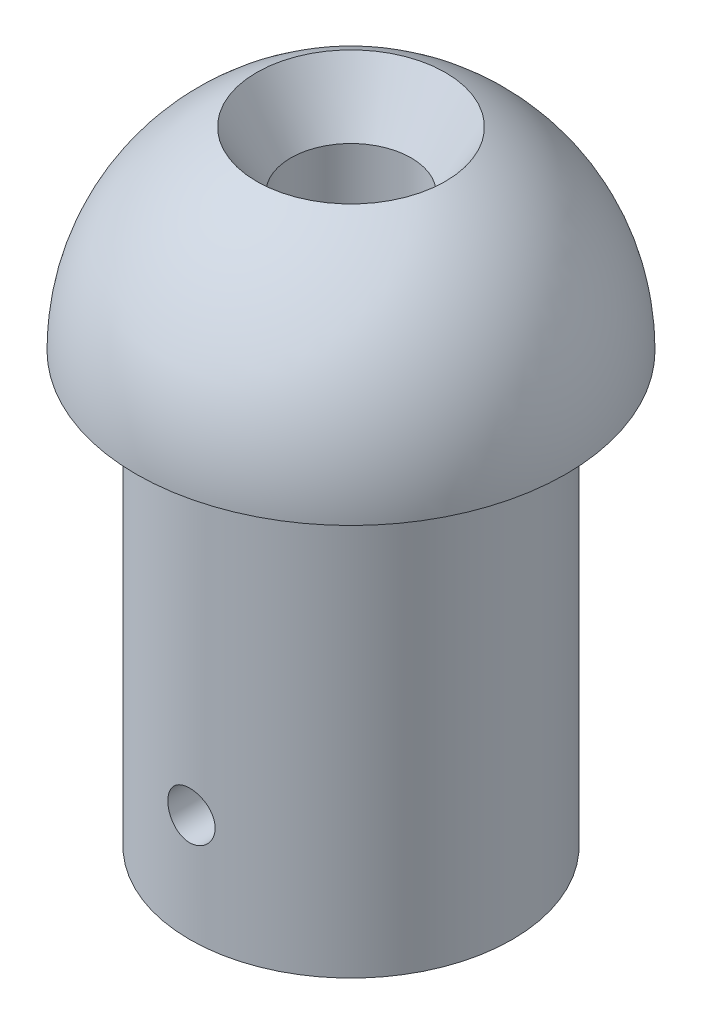
ISO-10303-21;
HEADER;
FILE_DESCRIPTION(('STEP AP214'),'2;1');
FILE_NAME('part.step','',(''),(''),'','','');
FILE_SCHEMA(('AUTOMOTIVE_DESIGN { 1 0 10303 214 1 1 1 1 }'));
ENDSEC;
DATA;
#1=APPLICATION_CONTEXT('core data for automotive mechanical design processes');
#2=APPLICATION_PROTOCOL_DEFINITION('international standard','automotive_design',2000,#1);
#3=PRODUCT_CONTEXT('',#1,'mechanical');
#4=PRODUCT('Part','Part','',(#3));
#5=PRODUCT_RELATED_PRODUCT_CATEGORY('part','',(#4));
#6=PRODUCT_DEFINITION_FORMATION('','',#4);
#7=PRODUCT_DEFINITION_CONTEXT('part definition',#1,'design');
#8=PRODUCT_DEFINITION('design','',#6,#7);
#9=PRODUCT_DEFINITION_SHAPE('','',#8);
#10=(LENGTH_UNIT() NAMED_UNIT(*) SI_UNIT(.MILLI.,.METRE.));
#11=(NAMED_UNIT(*) PLANE_ANGLE_UNIT() SI_UNIT($,.RADIAN.));
#12=(NAMED_UNIT(*) SI_UNIT($,.STERADIAN.) SOLID_ANGLE_UNIT());
#13=UNCERTAINTY_MEASURE_WITH_UNIT(LENGTH_MEASURE(1.E-05),#10,'distance_accuracy_value','');
#14=(GEOMETRIC_REPRESENTATION_CONTEXT(3) GLOBAL_UNCERTAINTY_ASSIGNED_CONTEXT((#13)) GLOBAL_UNIT_ASSIGNED_CONTEXT((#10,
#11,#12)) REPRESENTATION_CONTEXT('',''));
#15=CARTESIAN_POINT('',(0.,0.,0.));
#16=DIRECTION('',(0.,0.,1.));
#17=DIRECTION('',(1.,0.,0.));
#18=AXIS2_PLACEMENT_3D('',#15,#16,#17);
#19=CARTESIAN_POINT('',(12.7,0.,0.));
#20=DIRECTION('',(0.,1.,0.));
#21=DIRECTION('',(0.,0.,1.));
#22=AXIS2_PLACEMENT_3D('',#19,#20,#21);
#23=PLANE('',#22);
#24=CARTESIAN_POINT('',(0.,0.,0.));
#25=DIRECTION('',(0.,1.,0.));
#26=DIRECTION('',(0.,0.,1.));
#27=AXIS2_PLACEMENT_3D('',#24,#25,#26);
#28=CIRCLE('',#27,12.7);
#29=CARTESIAN_POINT('',(0.,0.,12.7));
#30=VERTEX_POINT('',#29);
#31=EDGE_CURVE('E41',#30,#30,#28,.T.);
#32=ORIENTED_EDGE('',*,*,#31,.F.);
#33=EDGE_LOOP('',(#32));
#34=FACE_BOUND('',#33,.T.);
#35=CARTESIAN_POINT('',(0.,0.,0.));
#36=DIRECTION('',(0.,1.,0.));
#37=DIRECTION('',(0.,0.,1.));
#38=AXIS2_PLACEMENT_3D('',#35,#36,#37);
#39=CIRCLE('',#38,9.525);
#40=CARTESIAN_POINT('',(0.,0.,9.525));
#41=VERTEX_POINT('',#40);
#42=EDGE_CURVE('E10',#41,#41,#39,.F.);
#43=ORIENTED_EDGE('',*,*,#42,.F.);
#44=EDGE_LOOP('',(#43));
#45=FACE_BOUND('',#44,.T.);
#46=ADVANCED_FACE('F30',(#34,#45),#23,.F.);
#47=CARTESIAN_POINT('',(0.,0.,0.));
#48=DIRECTION('',(0.,1.,0.));
#49=DIRECTION('',(1.,0.,0.));
#50=AXIS2_PLACEMENT_3D('',#47,#48,#49);
#51=SPHERICAL_SURFACE('',#50,12.7);
#52=CARTESIAN_POINT('',(0.,11.4107623075787,0.));
#53=DIRECTION('',(0.,-1.,0.));
#54=DIRECTION('',(0.,0.,-1.));
#55=AXIS2_PLACEMENT_3D('',#52,#53,#54);
#56=CIRCLE('',#55,5.57534784205806);
#57=CARTESIAN_POINT('',(0.,11.4107623075787,-5.57534784205806));
#58=VERTEX_POINT('',#57);
#59=EDGE_CURVE('E52',#58,#58,#56,.T.);
#60=ORIENTED_EDGE('',*,*,#59,.T.);
#61=EDGE_LOOP('',(#60));
#62=FACE_BOUND('',#61,.T.);
#63=ORIENTED_EDGE('',*,*,#31,.T.);
#64=EDGE_LOOP('',(#63));
#65=FACE_BOUND('',#64,.T.);
#66=ADVANCED_FACE('F85',(#62,#65),#51,.T.);
#67=CARTESIAN_POINT('',(0.,-25.4,0.));
#68=DIRECTION('',(0.,1.,0.));
#69=DIRECTION('',(0.,0.,1.));
#70=AXIS2_PLACEMENT_3D('',#67,#68,#69);
#71=CYLINDRICAL_SURFACE('',#70,9.525);
#72=CARTESIAN_POINT('',(0.,-20.447,9.525));
#73=CARTESIAN_POINT('',(-0.0780210704996163,-20.4469967672233,9.52499876909918));
#74=CARTESIAN_POINT('',(-0.156087914584497,-20.4404418385136,9.52403131437803));
#75=CARTESIAN_POINT('',(-0.310040917925296,-20.4144011568612,9.52026504812402));
#76=CARTESIAN_POINT('',(-0.385924855077812,-20.3949026823453,9.51746443490786));
#77=CARTESIAN_POINT('',(-0.533261643560541,-20.3435688802958,9.51034668937885));
#78=CARTESIAN_POINT('',(-0.604717745984399,-20.3117427317798,9.50603068562822));
#79=CARTESIAN_POINT('',(-0.741263844751881,-20.2366791185375,9.49635952075439));
#80=CARTESIAN_POINT('',(-0.806354753006522,-20.1934432917139,9.49100450881394));
#81=CARTESIAN_POINT('',(-0.928821082462877,-20.0964427980264,9.47980636130476));
#82=CARTESIAN_POINT('',(-0.986141981470261,-20.0426096371309,9.47396020022846));
#83=CARTESIAN_POINT('',(-1.09097086941622,-19.9260899654613,9.46246243475263));
#84=CARTESIAN_POINT('',(-1.13847830367028,-19.8634029545798,9.45681084136564));
#85=CARTESIAN_POINT('',(-1.22254270332514,-19.7305903299866,9.44631270759135));
#86=CARTESIAN_POINT('',(-1.25904714472436,-19.6604311351754,9.44147007635094));
#87=CARTESIAN_POINT('',(-1.31973370841209,-19.5148945418098,9.43317930633493));
#88=CARTESIAN_POINT('',(-1.34391647255257,-19.4395174152965,9.42973109492414));
#89=CARTESIAN_POINT('',(-1.37910438639669,-19.2862570823896,9.42464922825738));
#90=CARTESIAN_POINT('',(-1.39020271382686,-19.2083957021566,9.42300274850874));
#91=CARTESIAN_POINT('',(-1.39919532244802,-19.0518996355701,9.42167179392556));
#92=CARTESIAN_POINT('',(-1.39709032893349,-18.9732649919311,9.42198721131866));
#93=CARTESIAN_POINT('',(-1.37981224341869,-18.8181114864146,9.4245326835761));
#94=CARTESIAN_POINT('',(-1.36474276362178,-18.7415808012875,9.42674755753626));
#95=CARTESIAN_POINT('',(-1.32212559058948,-18.5921461095556,9.43281867440035));
#96=CARTESIAN_POINT('',(-1.29457755858661,-18.5192422014701,9.43667496186517));
#97=CARTESIAN_POINT('',(-1.22767699082081,-18.378814340724,9.44561123341711));
#98=CARTESIAN_POINT('',(-1.18828040503306,-18.3113116752701,9.45069576970471));
#99=CARTESIAN_POINT('',(-1.09883244492729,-18.183836053757,9.46151231965172));
#100=CARTESIAN_POINT('',(-1.04878040161725,-18.1238635708487,9.46724437395429));
#101=CARTESIAN_POINT('',(-0.938872789734266,-18.0125500838765,9.47877723825155));
#102=CARTESIAN_POINT('',(-0.87892810568412,-17.9612970427175,9.48457818182425));
#103=CARTESIAN_POINT('',(-0.751240994055762,-17.869565520666,9.49554428112557));
#104=CARTESIAN_POINT('',(-0.683498534990984,-17.8290870832824,9.50070943428676));
#105=CARTESIAN_POINT('',(-0.542063795670929,-17.7600499226544,9.50982703811476));
#106=CARTESIAN_POINT('',(-0.468368246360631,-17.7314978024135,9.51377881667706));
#107=CARTESIAN_POINT('',(-0.317157481006443,-17.6871992807633,9.52001873749491));
#108=CARTESIAN_POINT('',(-0.239642512080121,-17.6714520520248,9.52230698723073));
#109=CARTESIAN_POINT('',(-0.083752652687727,-17.6533268608748,9.52494783057845));
#110=CARTESIAN_POINT('',(-0.00539211241790786,-17.6508279330495,9.52531793735466));
#111=CARTESIAN_POINT('',(0.150629263927545,-17.6589494647484,9.52412841076372));
#112=CARTESIAN_POINT('',(0.228290120616937,-17.6695695364852,9.5225688344365));
#113=CARTESIAN_POINT('',(0.380342575781186,-17.7035270248034,9.51770601460028));
#114=CARTESIAN_POINT('',(0.454747575371576,-17.7268056876243,9.51441082897403));
#115=CARTESIAN_POINT('',(0.598598436432949,-17.7853577295366,9.50644515021481));
#116=CARTESIAN_POINT('',(0.668044073759443,-17.8206316503538,9.50177459496912));
#117=CARTESIAN_POINT('',(0.800538017888206,-17.90245797401,9.49153388290808));
#118=CARTESIAN_POINT('',(0.863538324836485,-17.9490873280162,9.48595767860855));
#119=CARTESIAN_POINT('',(0.980862347167357,-18.0521935003978,9.47454564183429));
#120=CARTESIAN_POINT('',(1.03518558127107,-18.1086708646357,9.46870979498127));
#121=CARTESIAN_POINT('',(1.13405200766557,-18.2304075991034,9.45738088813976));
#122=CARTESIAN_POINT('',(1.17851423763999,-18.2957330520076,9.45189091304804));
#123=CARTESIAN_POINT('',(1.25583427244825,-18.4329962484372,9.44192943482414));
#124=CARTESIAN_POINT('',(1.288692379862,-18.5049338194888,9.43745790513685));
#125=CARTESIAN_POINT('',(1.34174515764188,-18.653134953303,9.43006176055464));
#126=CARTESIAN_POINT('',(1.36198286842134,-18.7293828349094,9.42713189339786));
#127=CARTESIAN_POINT('',(1.3893576162155,-18.8842412428705,9.42313668695638));
#128=CARTESIAN_POINT('',(1.39649551479598,-18.9628516135003,9.42207122505122));
#129=CARTESIAN_POINT('',(1.39744819289425,-19.1193968047977,9.42192990451066));
#130=CARTESIAN_POINT('',(1.39139025343123,-19.197330863679,9.42283503836564));
#131=CARTESIAN_POINT('',(1.36639551201491,-19.351059225311,9.42649167860844));
#132=CARTESIAN_POINT('',(1.34745872714735,-19.4268535309002,9.42924318254678));
#133=CARTESIAN_POINT('',(1.29728812222023,-19.5741182249609,9.43627600219572));
#134=CARTESIAN_POINT('',(1.26606280699116,-19.645591564568,9.44055625967463));
#135=CARTESIAN_POINT('',(1.19221413195192,-19.7823054538423,9.45016565611076));
#136=CARTESIAN_POINT('',(1.1495904205166,-19.8475458111461,9.45549482742422));
#137=CARTESIAN_POINT('',(1.05369098517627,-19.9705890957686,9.46666284878057));
#138=CARTESIAN_POINT('',(1.00032089047267,-20.0283180943339,9.47250593597053));
#139=CARTESIAN_POINT('',(0.884643000756661,-20.1340463566769,9.48400774997678));
#140=CARTESIAN_POINT('',(0.822333127600794,-20.1820433518721,9.48966643355017));
#141=CARTESIAN_POINT('',(0.6901605685792,-20.2671690708114,9.50019567498149));
#142=CARTESIAN_POINT('',(0.62025994446501,-20.3042394076122,9.50506193879451));
#143=CARTESIAN_POINT('',(0.475187102460737,-20.3660585882825,9.51341580822303));
#144=CARTESIAN_POINT('',(0.400020477054556,-20.3908202842076,9.51690485107505));
#145=CARTESIAN_POINT('',(0.270424094763482,-20.4216569679818,9.52130826650232));
#146=CARTESIAN_POINT('',(0.216796975750918,-20.4311462072659,9.52268560961624));
#147=CARTESIAN_POINT('',(0.108787317613575,-20.4438188137598,9.52453190024634));
#148=CARTESIAN_POINT('',(0.0544047872741919,-20.447002254244,9.5250008583181));
#149=CARTESIAN_POINT('',(0.,-20.447,9.525));
#150=B_SPLINE_CURVE_WITH_KNOTS('',3,(#72,#73,#74,#75,#76,#77,#78,#79,#80,#81,#82,#83,#84,#85,
#86,#87,#88,#89,#90,#91,#92,#93,#94,#95,#96,#97,#98,#99,#100,#101,#102,#103,#104,#105,#106,#107,
#108,#109,#110,#111,#112,#113,#114,#115,#116,#117,#118,#119,#120,#121,#122,#123,#124,#125,#126,
#127,#128,#129,#130,#131,#132,#133,#134,#135,#136,#137,#138,#139,#140,#141,#142,#143,#144,#145,
#146,#147,#148,#149),.UNSPECIFIED.,.T.,.F.,(4,2,2,2,2,2,2,2,2,2,2,2,2,2,2,2,2,2,2,2,2,2,2,2,2,2,
2,2,2,2,2,2,2,2,2,2,2,2,4),(0.,0.233864421952269,0.467959038712357,0.701879685847083,
0.935766771037242,1.17121835301088,1.40668323972786,1.64325496344466,1.87981436257677,
2.11467878420653,2.34953030420524,2.58252214389512,2.81552030922159,3.04939564368206,
3.28328566609961,3.51941083672099,3.75553696082351,3.99179364338662,4.22803506009366,
4.46211568008177,4.69618938099253,4.92918580855113,5.16219276001445,5.39682493179859,
5.63147011307648,5.8679758205864,6.10447536070527,6.34016387098805,6.57583687964128,
6.80924676781341,7.04265634633265,7.27590466653922,7.50916018297206,7.74456117632801,
7.98001697999564,8.21670904259757,8.45315344153476,8.6162310806358,8.77930682473723),.UNSPECIFIED.);
#151=CARTESIAN_POINT('',(0.,-20.447,9.525));
#152=VERTEX_POINT('',#151);
#153=EDGE_CURVE('E53',#152,#152,#150,.T.);
#154=ORIENTED_EDGE('',*,*,#153,.T.);
#155=EDGE_LOOP('',(#154));
#156=FACE_BOUND('',#155,.T.);
#157=CARTESIAN_POINT('',(1.397,-19.05,-9.42199639142363));
#158=CARTESIAN_POINT('',(1.39699676285134,-18.9719840173659,-9.42199767288179));
#159=CARTESIAN_POINT('',(1.39044266017382,-18.8939222472952,-9.42297585532093));
#160=CARTESIAN_POINT('',(1.36440555734869,-18.7399797842974,-9.4267804122333));
#161=CARTESIAN_POINT('',(1.34490981732576,-18.6641013175062,-9.42960860783764));
#162=CARTESIAN_POINT('',(1.29358401255455,-18.5167761031052,-9.43678612767054));
#163=CARTESIAN_POINT('',(1.26176325618378,-18.4453260580905,-9.44113430370408));
#164=CARTESIAN_POINT('',(1.18671234609414,-18.308790133863,-9.45086048847592));
#165=CARTESIAN_POINT('',(1.14348381732021,-18.2437033500633,-9.45623835051386));
#166=CARTESIAN_POINT('',(1.04649073897578,-18.121232466278,-9.46746402139572));
#167=CARTESIAN_POINT('',(0.99265606112939,-18.0639041706813,-9.47331479643173));
#168=CARTESIAN_POINT('',(0.876130236233863,-17.9590609777023,-9.48480055763751));
#169=CARTESIAN_POINT('',(0.813438609403231,-17.9115466122848,-9.49043553209633));
#170=CARTESIAN_POINT('',(0.680621838342373,-17.8274748825157,-9.5008857333761));
#171=CARTESIAN_POINT('',(0.610463907209016,-17.7909687916549,-9.50569708038088));
#172=CARTESIAN_POINT('',(0.464930056832701,-17.7302788312865,-9.51392509841223));
#173=CARTESIAN_POINT('',(0.389554401660724,-17.7060943386952,-9.51734183996003));
#174=CARTESIAN_POINT('',(0.236298990795833,-17.6709029340882,-9.52237475131293));
#175=CARTESIAN_POINT('',(0.158441100752521,-17.659802652339,-9.52400367328308));
#176=CARTESIAN_POINT('',(0.00195189879086971,-17.6508049253288,-9.52532109390816));
#177=CARTESIAN_POINT('',(-0.0766793717106279,-17.6529067768565,-9.52500969591421));
#178=CARTESIAN_POINT('',(-0.231846511145324,-17.6701798050635,-9.52249176998468));
#179=CARTESIAN_POINT('',(-0.308393831490629,-17.685250535682,-9.52029980771572));
#180=CARTESIAN_POINT('',(-0.457861144543363,-17.7278759444575,-9.514283279723));
#181=CARTESIAN_POINT('',(-0.530781047201157,-17.7554309323612,-9.51045867349187));
#182=CARTESIAN_POINT('',(-0.671228616910437,-17.8223460701718,-9.50158153454396));
#183=CARTESIAN_POINT('',(-0.738735766970222,-17.8617486750733,-9.49652459843429));
#184=CARTESIAN_POINT('',(-0.866217821814206,-17.9512095723672,-9.48574670878224));
#185=CARTESIAN_POINT('',(-0.926192251895769,-18.0012685357748,-9.48002571343535));
#186=CARTESIAN_POINT('',(-1.03749823354175,-18.1111811617227,-9.46849454743781));
#187=CARTESIAN_POINT('',(-1.08874320977274,-18.171122501068,-9.46268404410849));
#188=CARTESIAN_POINT('',(-1.18046003834951,-18.2988000103715,-9.45168130669168));
#189=CARTESIAN_POINT('',(-1.22093182975891,-18.3665362244167,-9.44648907610142));
#190=CARTESIAN_POINT('',(-1.28996416457376,-18.5079690558613,-9.43731089411525));
#191=CARTESIAN_POINT('',(-1.31851609183275,-18.581669938976,-9.43332581586551));
#192=CARTESIAN_POINT('',(-1.36281260310173,-18.7328923296602,-9.42702880542894));
#193=CARTESIAN_POINT('',(-1.37855804813815,-18.8104135800009,-9.42471676075913));
#194=CARTESIAN_POINT('',(-1.39667649173775,-18.9663066994471,-9.4220488299596));
#195=CARTESIAN_POINT('',(-1.39917208881502,-19.0446640236169,-9.42167501053179));
#196=CARTESIAN_POINT('',(-1.39104504342604,-19.200678175921,-9.42287827070066));
#197=CARTESIAN_POINT('',(-1.3804227895134,-19.2783350247348,-9.42445529251299));
#198=CARTESIAN_POINT('',(-1.34646544255553,-19.4303658064378,-9.4293660870893));
#199=CARTESIAN_POINT('',(-1.32319118218221,-19.5047536221445,-9.43269145108022));
#200=CARTESIAN_POINT('',(-1.2646536775187,-19.6485720550273,-9.44071732924662));
#201=CARTESIAN_POINT('',(-1.22938986516604,-19.7180024371327,-9.44541790857805));
#202=CARTESIAN_POINT('',(-1.14757872497051,-19.8504854364628,-9.45570693407215));
#203=CARTESIAN_POINT('',(-1.10095188655486,-19.9134884678601,-9.46130153660652));
#204=CARTESIAN_POINT('',(-0.997849056792462,-20.0308191529752,-9.47272958734958));
#205=CARTESIAN_POINT('',(-0.941372533749071,-20.0851463380581,-9.47856304843911));
#206=CARTESIAN_POINT('',(-0.819634195300519,-20.1840220915202,-9.48986744592369));
#207=CARTESIAN_POINT('',(-0.754306123443428,-20.2284895094429,-9.49533513254887));
#208=CARTESIAN_POINT('',(-0.617036229955225,-20.305818636582,-9.50524170480229));
#209=CARTESIAN_POINT('',(-0.545094582788759,-20.3386806518357,-9.50968061755849));
#210=CARTESIAN_POINT('',(-0.396895385298016,-20.3917358515556,-9.51701523336544));
#211=CARTESIAN_POINT('',(-0.320654129318384,-20.4119737668575,-9.51991637961139));
#212=CARTESIAN_POINT('',(-0.165809758849993,-20.4393511659007,-9.52387139715076));
#213=CARTESIAN_POINT('',(-0.0872067935196338,-20.4464914750871,-9.52492538485673));
#214=CARTESIAN_POINT('',(0.0693419307930238,-20.4474515059165,-9.52506625213224));
#215=CARTESIAN_POINT('',(0.147286939597246,-20.4413955293138,-9.5241714879133));
#216=CARTESIAN_POINT('',(0.301037708669674,-20.4164008753828,-9.52055232237077));
#217=CARTESIAN_POINT('',(0.376843474916952,-20.3974622340646,-9.51782792616144));
#218=CARTESIAN_POINT('',(0.524132305961907,-20.347283244093,-9.51085417844597));
#219=CARTESIAN_POINT('',(0.595618226788666,-20.3160511281207,-9.50660584765521));
#220=CARTESIAN_POINT('',(0.732354463610582,-20.2421849332848,-9.49705139341979));
#221=CARTESIAN_POINT('',(0.797604595062102,-20.1995505171204,-9.49174523868394));
#222=CARTESIAN_POINT('',(0.920648232603979,-20.1036389221635,-9.48060589751891));
#223=CARTESIAN_POINT('',(0.978369721638561,-20.0502698444195,-9.47476841650955));
#224=CARTESIAN_POINT('',(1.08408330552765,-19.9345971298722,-9.463256494095));
#225=CARTESIAN_POINT('',(1.13207311165234,-19.8722913971853,-9.45758209131178));
#226=CARTESIAN_POINT('',(1.21719063371036,-19.7401225838185,-9.44700623982969));
#227=CARTESIAN_POINT('',(1.25425878692192,-19.6702208080644,-9.44210909449029));
#228=CARTESIAN_POINT('',(1.31607357125917,-19.5251456095758,-9.43369265271654));
#229=CARTESIAN_POINT('',(1.34083307804591,-19.4499777898132,-9.43017191729331));
#230=CARTESIAN_POINT('',(1.37166392676348,-19.3203871886752,-9.42572635028427));
#231=CARTESIAN_POINT('',(1.38115054492929,-19.2667674502698,-9.4243349661828));
#232=CARTESIAN_POINT('',(1.39381967198486,-19.1587725553234,-9.4224695455463));
#233=CARTESIAN_POINT('',(1.3970022571336,-19.1043974079286,-9.42199549791439));
#234=CARTESIAN_POINT('',(1.397,-19.05,-9.42199639142363));
#235=B_SPLINE_CURVE_WITH_KNOTS('',3,(#157,#158,#159,#160,#161,#162,#163,#164,#165,#166,#167,
#168,#169,#170,#171,#172,#173,#174,#175,#176,#177,#178,#179,#180,#181,#182,#183,#184,#185,#186,
#187,#188,#189,#190,#191,#192,#193,#194,#195,#196,#197,#198,#199,#200,#201,#202,#203,#204,#205,
#206,#207,#208,#209,#210,#211,#212,#213,#214,#215,#216,#217,#218,#219,#220,#221,#222,#223,#224,
#225,#226,#227,#228,#229,#230,#231,#232,#233,#234),.UNSPECIFIED.,.T.,.F.,(4,2,2,2,2,2,2,2,2,2,2,
2,2,2,2,2,2,2,2,2,2,2,2,2,2,2,2,2,2,2,2,2,2,2,2,2,2,2,4),(0.,0.233849135154113,
0.467928815759328,0.701832053050179,0.93570199068278,1.17117358281676,1.40665793535637,
1.64322274394413,1.87977558863891,2.11462995673902,2.3494718154323,2.5825109907739,
2.81555594836418,3.04944616325996,3.28335111023831,3.51945555216475,3.7555613295405,
3.99183747918746,4.22809774181518,4.46216807072411,4.69623146658506,4.92917927979296,
5.16213813155799,5.39677639144071,5.63142732127374,5.867943215344,6.10445287196698,
6.34011967399912,6.57577162318802,6.80921346305286,7.04265465039524,7.27593977234034,
7.50923179605185,7.74461323208761,7.98004996188036,8.21674787076248,8.45319765415942,
8.6162532262817,8.77930682593182),.UNSPECIFIED.);
#236=CARTESIAN_POINT('',(1.397,-19.05,-9.42199639142363));
#237=VERTEX_POINT('',#236);
#238=EDGE_CURVE('E73',#237,#237,#235,.T.);
#239=ORIENTED_EDGE('',*,*,#238,.T.);
#240=EDGE_LOOP('',(#239));
#241=FACE_BOUND('',#240,.T.);
#242=CARTESIAN_POINT('',(0.,-25.4,0.));
#243=DIRECTION('',(0.,-1.,0.));
#244=DIRECTION('',(0.,0.,-1.));
#245=AXIS2_PLACEMENT_3D('',#242,#243,#244);
#246=CIRCLE('',#245,9.525);
#247=CARTESIAN_POINT('',(0.,-25.4,-9.525));
#248=VERTEX_POINT('',#247);
#249=EDGE_CURVE('E46',#248,#248,#246,.T.);
#250=ORIENTED_EDGE('',*,*,#249,.F.);
#251=EDGE_LOOP('',(#250));
#252=FACE_BOUND('',#251,.T.);
#253=ORIENTED_EDGE('',*,*,#42,.T.);
#254=EDGE_LOOP('',(#253));
#255=FACE_BOUND('',#254,.T.);
#256=ADVANCED_FACE('F81',(#156,#241,#252,#255),#71,.T.);
#257=CARTESIAN_POINT('',(0.,-25.4,0.));
#258=DIRECTION('',(0.,-1.,0.));
#259=DIRECTION('',(0.,0.,-1.));
#260=AXIS2_PLACEMENT_3D('',#257,#258,#259);
#261=PLANE('',#260);
#262=CARTESIAN_POINT('',(0.,-25.4,0.));
#263=DIRECTION('',(0.,-1.,0.));
#264=DIRECTION('',(0.,0.,-1.));
#265=AXIS2_PLACEMENT_3D('',#262,#263,#264);
#266=CIRCLE('',#265,3.556);
#267=CARTESIAN_POINT('',(0.,-25.4,-3.556));
#268=VERTEX_POINT('',#267);
#269=EDGE_CURVE('E100',#268,#268,#266,.T.);
#270=ORIENTED_EDGE('',*,*,#269,.F.);
#271=EDGE_LOOP('',(#270));
#272=FACE_BOUND('',#271,.T.);
#273=ORIENTED_EDGE('',*,*,#249,.T.);
#274=EDGE_LOOP('',(#273));
#275=FACE_BOUND('',#274,.T.);
#276=ADVANCED_FACE('F84',(#272,#275),#261,.T.);
#277=CARTESIAN_POINT('',(0.,12.7,0.));
#278=DIRECTION('',(0.,-1.,0.));
#279=DIRECTION('',(0.,0.,-1.));
#280=AXIS2_PLACEMENT_3D('',#277,#278,#279);
#281=CYLINDRICAL_SURFACE('',#280,3.556);
#282=CARTESIAN_POINT('',(0.,-17.653,-3.556));
#283=CARTESIAN_POINT('',(0.0752096394793704,-17.6530076319669,-3.55599445952947));
#284=CARTESIAN_POINT('',(0.150532826812047,-17.6591081275793,-3.55358645135626));
#285=CARTESIAN_POINT('',(0.299056810662439,-17.6833013890585,-3.54418878525722));
#286=CARTESIAN_POINT('',(0.372251671165454,-17.7014248583416,-3.53718739759184));
#287=CARTESIAN_POINT('',(0.514140100914354,-17.7489061623408,-3.51935946936014));
#288=CARTESIAN_POINT('',(0.582847066257069,-17.7782285881829,-3.5085449932155));
#289=CARTESIAN_POINT('',(0.714310372484654,-17.8471363727759,-3.48416024689211));
#290=CARTESIAN_POINT('',(0.777068537272757,-17.886718571888,-3.47059082541513));
#291=CARTESIAN_POINT('',(0.897805651441464,-17.9769357765538,-3.44138045744147));
#292=CARTESIAN_POINT('',(0.955476588115778,-18.0279625374068,-3.42567676260911));
#293=CARTESIAN_POINT('',(1.06170047531583,-18.1387933761201,-3.39426023859426));
#294=CARTESIAN_POINT('',(1.11024923902502,-18.1986014620331,-3.37854740852156));
#295=CARTESIAN_POINT('',(1.19888517561383,-18.3283935381236,-3.34814914028908));
#296=CARTESIAN_POINT('',(1.23852387839215,-18.3987024449674,-3.33353596563028));
#297=CARTESIAN_POINT('',(1.30527566635602,-18.5456506008805,-3.30797198597662));
#298=CARTESIAN_POINT('',(1.33239444791956,-18.6222869523092,-3.29701951604291));
#299=CARTESIAN_POINT('',(1.37210135543248,-18.7761779891496,-3.28068881804998));
#300=CARTESIAN_POINT('',(1.38527785762877,-18.8532561712489,-3.27508594673397));
#301=CARTESIAN_POINT('',(1.39856471541582,-19.0087174974896,-3.26943577172758));
#302=CARTESIAN_POINT('',(1.39868119480778,-19.0871000127891,-3.26938586427103));
#303=CARTESIAN_POINT('',(1.38629178591155,-19.2373720865569,-3.2746550011933));
#304=CARTESIAN_POINT('',(1.37462738771861,-19.3093459797548,-3.27961611752454));
#305=CARTESIAN_POINT('',(1.34040692193756,-19.4502180414665,-3.29374928464241));
#306=CARTESIAN_POINT('',(1.31784902681655,-19.5191156917789,-3.30292204197662));
#307=CARTESIAN_POINT('',(1.26205814549695,-19.6535059357767,-3.32464335632606));
#308=CARTESIAN_POINT('',(1.22862064882538,-19.7189028492151,-3.33725577002561));
#309=CARTESIAN_POINT('',(1.1521629846682,-19.8433916811422,-3.36441665469177));
#310=CARTESIAN_POINT('',(1.10913929999845,-19.9024812736674,-3.37896583546988));
#311=CARTESIAN_POINT('',(1.01096963365884,-20.017299800484,-3.40967872230425));
#312=CARTESIAN_POINT('',(0.955160296000252,-20.0724524503199,-3.42588205165234));
#313=CARTESIAN_POINT('',(0.834907737099825,-20.1727963550928,-3.45715510033347));
#314=CARTESIAN_POINT('',(0.770462919098604,-20.2179857636607,-3.47222460920873));
#315=CARTESIAN_POINT('',(0.633182387333952,-20.2978407650448,-3.4998859194035));
#316=CARTESIAN_POINT('',(0.560213808827268,-20.3322968313634,-3.51242688241912));
#317=CARTESIAN_POINT('',(0.408898914805353,-20.3882482524788,-3.53323593547866));
#318=CARTESIAN_POINT('',(0.330555251893606,-20.4097499497337,-3.54150611621346));
#319=CARTESIAN_POINT('',(0.175550353742705,-20.4380336411,-3.55246469930279));
#320=CARTESIAN_POINT('',(0.0990511716281736,-20.4455905418617,-3.55544656456768));
#321=CARTESIAN_POINT('',(-0.054172504571953,-20.4480490030638,-3.55641183586251));
#322=CARTESIAN_POINT('',(-0.130896938071563,-20.4429537017374,-3.55439648139549));
#323=CARTESIAN_POINT('',(-0.27892875059093,-20.4208280063292,-3.54578638723096));
#324=CARTESIAN_POINT('',(-0.350327191595978,-20.4043203249516,-3.53939231917926));
#325=CARTESIAN_POINT('',(-0.489279609146254,-20.3605429775007,-3.52287391919399));
#326=CARTESIAN_POINT('',(-0.556833088096373,-20.3332719220943,-3.51274910570813));
#327=CARTESIAN_POINT('',(-0.68847825541224,-20.2678559353777,-3.4893754181037));
#328=CARTESIAN_POINT('',(-0.752403032252238,-20.2294065640124,-3.47604118073784));
#329=CARTESIAN_POINT('',(-0.87311526858006,-20.1430648345115,-3.44770305621111));
#330=CARTESIAN_POINT('',(-0.929899912168704,-20.0951687698319,-3.43269851469256));
#331=CARTESIAN_POINT('',(-1.03851206725909,-19.9877110411585,-3.40147376059565));
#332=CARTESIAN_POINT('',(-1.0897932771099,-19.9276005720936,-3.38523700027736));
#333=CARTESIAN_POINT('',(-1.18166723457167,-19.7993300176683,-3.35427419467192));
#334=CARTESIAN_POINT('',(-1.22225847584628,-19.7311687998253,-3.33954836246972));
#335=CARTESIAN_POINT('',(-1.2917890220528,-19.5878478171574,-3.31327880942927));
#336=CARTESIAN_POINT('',(-1.32063311652262,-19.5126367160236,-3.30176132044728));
#337=CARTESIAN_POINT('',(-1.36503324505321,-19.3578385970879,-3.28365743452605));
#338=CARTESIAN_POINT('',(-1.38059860969114,-19.2782546938507,-3.27706757548731));
#339=CARTESIAN_POINT('',(-1.3971237455195,-19.1229528190862,-3.27005417427101));
#340=CARTESIAN_POINT('',(-1.39902675293196,-19.047352509026,-3.26923249765581));
#341=CARTESIAN_POINT('',(-1.39063258138223,-18.8969657678617,-3.27281189217455));
#342=CARTESIAN_POINT('',(-1.38033682562994,-18.8221792428419,-3.27721235405016));
#343=CARTESIAN_POINT('',(-1.34859770421333,-18.6783546967629,-3.29039461829722));
#344=CARTESIAN_POINT('',(-1.32757836030655,-18.6092064128169,-3.29900928860876));
#345=CARTESIAN_POINT('',(-1.27537853195248,-18.4753865659553,-3.31953733560722));
#346=CARTESIAN_POINT('',(-1.24419536738642,-18.4107161892878,-3.33145158224152));
#347=CARTESIAN_POINT('',(-1.17053622728676,-18.28375069978,-3.35806404691565));
#348=CARTESIAN_POINT('',(-1.1275263598774,-18.2217905270676,-3.37288067132765));
#349=CARTESIAN_POINT('',(-1.03222563259687,-18.1056668547763,-3.40325505111581));
#350=CARTESIAN_POINT('',(-0.979931556074144,-18.051506069227,-3.4188130619851));
#351=CARTESIAN_POINT('',(-0.863704256505048,-17.949097759845,-3.45007064559259));
#352=CARTESIAN_POINT('',(-0.799251811655935,-17.901421667573,-3.46571966870408));
#353=CARTESIAN_POINT('',(-0.662680299813164,-17.817572137608,-3.49440234878523));
#354=CARTESIAN_POINT('',(-0.590560194945508,-17.7814002597462,-3.50743565100667));
#355=CARTESIAN_POINT('',(-0.447003581658641,-17.7243863732815,-3.52847545985939));
#356=CARTESIAN_POINT('',(-0.376027210746761,-17.70250491311,-3.53681439081332));
#357=CARTESIAN_POINT('',(-0.231265898399354,-17.6702930013374,-3.54920983010511));
#358=CARTESIAN_POINT('',(-0.15748927323391,-17.6599307501288,-3.55327812609868));
#359=CARTESIAN_POINT('',(-0.0556412271931806,-17.6538285143577,-3.55567518286159));
#360=CARTESIAN_POINT('',(-0.0278283864051014,-17.6529971760891,-3.55600205003449));
#361=CARTESIAN_POINT('',(0.,-17.653,-3.556));
#362=B_SPLINE_CURVE_WITH_KNOTS('',3,(#282,#283,#284,#285,#286,#287,#288,#289,#290,#291,#292,
#293,#294,#295,#296,#297,#298,#299,#300,#301,#302,#303,#304,#305,#306,#307,#308,#309,#310,#311,
#312,#313,#314,#315,#316,#317,#318,#319,#320,#321,#322,#323,#324,#325,#326,#327,#328,#329,#330,
#331,#332,#333,#334,#335,#336,#337,#338,#339,#340,#341,#342,#343,#344,#345,#346,#347,#348,#349,
#350,#351,#352,#353,#354,#355,#356,#357,#358,#359,#360,#361),.UNSPECIFIED.,.T.,.F.,(4,2,2,2,2,2,
2,2,2,2,2,2,2,2,2,2,2,2,2,2,2,2,2,2,2,2,2,2,2,2,2,2,2,2,2,2,2,2,2,4),(0.,0.22554673188919,
0.451671677738869,0.677087502358857,0.902433989374563,1.13716819281324,1.37200987077196,
1.6168539768938,1.86158657253348,2.09552010528048,2.32934394691413,2.54756995080591,
2.76583257781589,2.98846116779633,3.21117157538021,3.45043640972477,3.68974554698146,
3.9334695355991,4.17707409979363,4.40667908487184,4.63622712476422,4.8559030683463,
5.07560737691297,5.30196869978725,5.52841901605522,5.76929640649131,6.0102077211114,
6.25303451773228,6.49569054615505,6.72141697337954,6.94711706806062,7.1645143038467,
7.38196891199776,7.61158104918036,7.84127289468444,8.08514400446453,8.3290481661148,
8.55228007331663,8.77489419045897,8.85834893975533),.UNSPECIFIED.);
#363=CARTESIAN_POINT('',(0.,-17.653,-3.556));
#364=VERTEX_POINT('',#363);
#365=EDGE_CURVE('E33',#364,#364,#362,.T.);
#366=ORIENTED_EDGE('',*,*,#365,.T.);
#367=EDGE_LOOP('',(#366));
#368=FACE_BOUND('',#367,.T.);
#369=CARTESIAN_POINT('',(1.397,-19.05,3.27009587015427));
#370=CARTESIAN_POINT('',(1.39699206246514,-18.9750407958542,3.27010307842141));
#371=CARTESIAN_POINT('',(1.39093089578343,-18.8999687652632,3.2727095979138));
#372=CARTESIAN_POINT('',(1.3669084735833,-18.7519708187168,3.28281219319339));
#373=CARTESIAN_POINT('',(1.34891616182695,-18.6790510237086,3.29032102869963));
#374=CARTESIAN_POINT('',(1.30181754514263,-18.5377463347808,3.30923614275646));
#375=CARTESIAN_POINT('',(1.2727521832016,-18.4693458111207,3.32062804738008));
#376=CARTESIAN_POINT('',(1.20445162955291,-18.3384091394221,3.34600568169988));
#377=CARTESIAN_POINT('',(1.16521892585142,-18.2758715617785,3.35999077658985));
#378=CARTESIAN_POINT('',(1.07538240071369,-18.1549504750021,3.38984289235562));
#379=CARTESIAN_POINT('',(1.0243082315864,-18.0969308365869,3.4057690385836));
#380=CARTESIAN_POINT('',(0.913229399449043,-17.9900157786807,3.43721948445972));
#381=CARTESIAN_POINT('',(0.853221685068172,-17.9411234896686,3.45274364466898));
#382=CARTESIAN_POINT('',(0.723189044682835,-17.8520662712053,3.48234675064645));
#383=CARTESIAN_POINT('',(0.652871117729023,-17.8123013032881,3.49634884190309));
#384=CARTESIAN_POINT('',(0.505895957414786,-17.745318931441,3.52061651897314));
#385=CARTESIAN_POINT('',(0.429241231455121,-17.7180965922963,3.53088357409588));
#386=CARTESIAN_POINT('',(0.275580882696775,-17.6782621010736,3.54610615084756));
#387=CARTESIAN_POINT('',(0.198760197897492,-17.6650248169429,3.55128812515267));
#388=CARTESIAN_POINT('',(0.0438248069511241,-17.6515261501035,3.55657347460185));
#389=CARTESIAN_POINT('',(-0.034289424177039,-17.6512601053269,3.55667867441857));
#390=CARTESIAN_POINT('',(-0.185086785851889,-17.6633624830107,3.5519382626187));
#391=CARTESIAN_POINT('',(-0.257834764598027,-17.6750467081582,3.54736075067953));
#392=CARTESIAN_POINT('',(-0.400241306385006,-17.7095579458477,3.53412778533386));
#393=CARTESIAN_POINT('',(-0.46989964303131,-17.7323857734743,3.52547203363135));
#394=CARTESIAN_POINT('',(-0.605392045555212,-17.7888189582906,3.50476928186166));
#395=CARTESIAN_POINT('',(-0.671153363211884,-17.8225803486823,3.49267351373464));
#396=CARTESIAN_POINT('',(-0.79624535323314,-17.8997785913963,3.46629803466174));
#397=CARTESIAN_POINT('',(-0.855573846269798,-17.9432187075692,3.45201758751075));
#398=CARTESIAN_POINT('',(-0.970120409696908,-18.041764019367,3.42165668638068));
#399=CARTESIAN_POINT('',(-1.02483710057863,-18.0974353874757,3.40551951576994));
#400=CARTESIAN_POINT('',(-1.12435850940323,-18.2172371268095,3.37397178040603));
#401=CARTESIAN_POINT('',(-1.16916021226997,-18.2813700616986,3.35856143779392));
#402=CARTESIAN_POINT('',(-1.24867033345297,-18.4184386940898,3.32983455687461));
#403=CARTESIAN_POINT('',(-1.2830809085815,-18.4915621540176,3.31658407167822));
#404=CARTESIAN_POINT('',(-1.33890304574702,-18.6432248359348,3.29444793194332));
#405=CARTESIAN_POINT('',(-1.36032269602005,-18.7217606541601,3.285559562182));
#406=CARTESIAN_POINT('',(-1.38835841976723,-18.8770294240019,3.27380753854538));
#407=CARTESIAN_POINT('',(-1.395778543862,-18.9535921824383,3.27061725859052));
#408=CARTESIAN_POINT('',(-1.39794238046441,-19.1069185880534,3.26969369698419));
#409=CARTESIAN_POINT('',(-1.39268972875603,-19.1836821713042,3.27195885018386));
#410=CARTESIAN_POINT('',(-1.37038838011964,-19.3308680005241,3.28135670465542));
#411=CARTESIAN_POINT('',(-1.35399337499504,-19.4014086162168,3.28821937895129));
#412=CARTESIAN_POINT('',(-1.31071324885833,-19.5386953118651,3.30570832866052));
#413=CARTESIAN_POINT('',(-1.2838258533504,-19.6054405654814,3.31633542006212));
#414=CARTESIAN_POINT('',(-1.21912911000272,-19.7361957069237,3.34067305711462));
#415=CARTESIAN_POINT('',(-1.18092838576694,-19.7999916653275,3.35448930534766));
#416=CARTESIAN_POINT('',(-1.09509410904457,-19.9205507149686,3.38348261511571));
#417=CARTESIAN_POINT('',(-1.04745682377721,-19.9773110086466,3.39866021385017));
#418=CARTESIAN_POINT('',(-0.940118891763082,-20.0863604952484,3.4299634081795));
#419=CARTESIAN_POINT('',(-0.879803103460335,-20.1380489818115,3.4460800772986));
#420=CARTESIAN_POINT('',(-0.750965315950207,-20.230657778047,3.47642946490811));
#421=CARTESIAN_POINT('',(-0.682443080929653,-20.2715777781776,3.49066212923669));
#422=CARTESIAN_POINT('',(-0.538986137525918,-20.3412983993453,3.51566748688608));
#423=CARTESIAN_POINT('',(-0.464059711240337,-20.3701143965899,3.5264445658316));
#424=CARTESIAN_POINT('',(-0.309897320173569,-20.4145506703709,3.54331741948434));
#425=CARTESIAN_POINT('',(-0.230663624961135,-20.4301778259417,3.54941563444175));
#426=CARTESIAN_POINT('',(-0.0755394192497912,-20.4469972259985,3.5559913690493));
#427=CARTESIAN_POINT('',(0.000245584857383845,-20.4490399303779,3.55679998939084));
#428=CARTESIAN_POINT('',(0.151038609642487,-20.4408613390368,3.55359079405575));
#429=CARTESIAN_POINT('',(0.226046739302858,-20.4306417876678,3.5495736648598));
#430=CARTESIAN_POINT('',(0.370946710827054,-20.3988342220693,3.53732600187143));
#431=CARTESIAN_POINT('',(0.440923698696819,-20.3775822715171,3.52922021131582));
#432=CARTESIAN_POINT('',(0.576311669483451,-20.3246606469746,3.5096558500993));
#433=CARTESIAN_POINT('',(0.641721793500373,-20.2929890196967,3.49819665084814));
#434=CARTESIAN_POINT('',(0.769254660287692,-20.218564728164,3.47243441046902));
#435=CARTESIAN_POINT('',(0.831109211078605,-20.1753886562412,3.45802905468975));
#436=CARTESIAN_POINT('',(0.946950240583397,-20.0798237670003,3.42811998460341));
#437=CARTESIAN_POINT('',(1.00093361468355,-20.02743133237,3.41261584046704));
#438=CARTESIAN_POINT('',(1.10280349975323,-19.9112491279728,3.38111979055061));
#439=CARTESIAN_POINT('',(1.15013939682189,-19.8469680500248,3.365153398337));
#440=CARTESIAN_POINT('',(1.23338391502457,-19.7108565691523,3.33554511949118));
#441=CARTESIAN_POINT('',(1.26929102027652,-19.6390251664537,3.32190354132702));
#442=CARTESIAN_POINT('',(1.32582951319467,-19.4962690003063,3.29972019060575));
#443=CARTESIAN_POINT('',(1.34752490230326,-19.4258178431539,3.29083593779104));
#444=CARTESIAN_POINT('',(1.379539206854,-19.2820945588416,3.27754782650117));
#445=CARTESIAN_POINT('',(1.38989018914411,-19.2088309921915,3.27313134187617));
#446=CARTESIAN_POINT('',(1.39613445767888,-19.1068705649076,3.27046465814276));
#447=CARTESIAN_POINT('',(1.3970030119119,-19.0784434050366,3.27009313496432));
#448=CARTESIAN_POINT('',(1.397,-19.05,3.27009587015427));
#449=B_SPLINE_CURVE_WITH_KNOTS('',3,(#369,#370,#371,#372,#373,#374,#375,#376,#377,#378,#379,
#380,#381,#382,#383,#384,#385,#386,#387,#388,#389,#390,#391,#392,#393,#394,#395,#396,#397,#398,
#399,#400,#401,#402,#403,#404,#405,#406,#407,#408,#409,#410,#411,#412,#413,#414,#415,#416,#417,
#418,#419,#420,#421,#422,#423,#424,#425,#426,#427,#428,#429,#430,#431,#432,#433,#434,#435,#436,
#437,#438,#439,#440,#441,#442,#443,#444,#445,#446,#447,#448),.UNSPECIFIED.,.T.,.F.,(4,2,2,2,2,2,
2,2,2,2,2,2,2,2,2,2,2,2,2,2,2,2,2,2,2,2,2,2,2,2,2,2,2,2,2,2,2,2,2,4),(0.,0.224791594068794,
0.450170619523378,0.674724261640156,0.89922300600832,1.13494287679155,1.37074344633349,
1.61546122658589,1.86008263402576,2.09323550104132,2.32630456862264,2.54673776623131,
2.76718708956001,2.99093237510668,3.21475322633013,3.45280860841983,3.69093628226166,
3.93535349829303,4.17961838190589,4.40936806520506,4.63905184180034,4.85630689798426,
5.07360907598143,5.29954190569163,5.52556428581023,5.76758242717248,6.00960752462268,
6.25132423103633,6.49291478482978,6.71922533376932,6.94550369300998,7.16526191544928,
7.38506135757611,7.61445676518873,7.84394240945973,8.08702255708025,8.33013493272978,
8.55191300055658,8.7730625460022,8.85836012128699),.UNSPECIFIED.);
#450=CARTESIAN_POINT('',(1.397,-19.05,3.27009587015427));
#451=VERTEX_POINT('',#450);
#452=EDGE_CURVE('E54',#451,#451,#449,.T.);
#453=ORIENTED_EDGE('',*,*,#452,.T.);
#454=EDGE_LOOP('',(#453));
#455=FACE_BOUND('',#454,.T.);
#456=CARTESIAN_POINT('',(0.,8.05000312631266,0.));
#457=DIRECTION('',(0.,1.,0.));
#458=DIRECTION('',(0.,0.,1.));
#459=AXIS2_PLACEMENT_3D('',#456,#457,#458);
#460=CIRCLE('',#459,3.556);
#461=CARTESIAN_POINT('',(0.,8.05000312631266,3.556));
#462=VERTEX_POINT('',#461);
#463=EDGE_CURVE('E50',#462,#462,#460,.T.);
#464=ORIENTED_EDGE('',*,*,#463,.T.);
#465=EDGE_LOOP('',(#464));
#466=FACE_BOUND('',#465,.T.);
#467=ORIENTED_EDGE('',*,*,#269,.T.);
#468=EDGE_LOOP('',(#467));
#469=FACE_BOUND('',#468,.T.);
#470=ADVANCED_FACE('F58',(#368,#455,#466,#469),#281,.F.);
#471=CARTESIAN_POINT('',(0.,12.7,0.));
#472=DIRECTION('',(0.,1.,0.));
#473=DIRECTION('',(0.,0.,1.));
#474=AXIS2_PLACEMENT_3D('',#471,#472,#473);
#475=CONICAL_SURFACE('',#474,6.35,0.541052068118243);
#476=ORIENTED_EDGE('',*,*,#463,.F.);
#477=EDGE_LOOP('',(#476));
#478=FACE_BOUND('',#477,.T.);
#479=ORIENTED_EDGE('',*,*,#59,.F.);
#480=EDGE_LOOP('',(#479));
#481=FACE_BOUND('',#480,.T.);
#482=ADVANCED_FACE('F66',(#478,#481),#475,.F.);
#483=CARTESIAN_POINT('',(0.,-19.05,-12.7));
#484=DIRECTION('',(0.,0.,1.));
#485=DIRECTION('',(1.,0.,0.));
#486=AXIS2_PLACEMENT_3D('',#483,#484,#485);
#487=CYLINDRICAL_SURFACE('',#486,1.397);
#488=ORIENTED_EDGE('',*,*,#452,.F.);
#489=EDGE_LOOP('',(#488));
#490=FACE_BOUND('',#489,.T.);
#491=ORIENTED_EDGE('',*,*,#153,.F.);
#492=EDGE_LOOP('',(#491));
#493=FACE_BOUND('',#492,.T.);
#494=ADVANCED_FACE('F62',(#490,#493),#487,.F.);
#495=ORIENTED_EDGE('',*,*,#365,.F.);
#496=EDGE_LOOP('',(#495));
#497=FACE_BOUND('',#496,.T.);
#498=ORIENTED_EDGE('',*,*,#238,.F.);
#499=EDGE_LOOP('',(#498));
#500=FACE_BOUND('',#499,.T.);
#501=ADVANCED_FACE('F65',(#497,#500),#487,.F.);
#502=CLOSED_SHELL('',(#46,#66,#256,#276,#470,#482,#494,#501));
#503=MANIFOLD_SOLID_BREP('B2',#502);
#504=ADVANCED_BREP_SHAPE_REPRESENTATION('',(#18,#503),#14);
#505=SHAPE_DEFINITION_REPRESENTATION(#9,#504);
ENDSEC;
END-ISO-10303-21;
